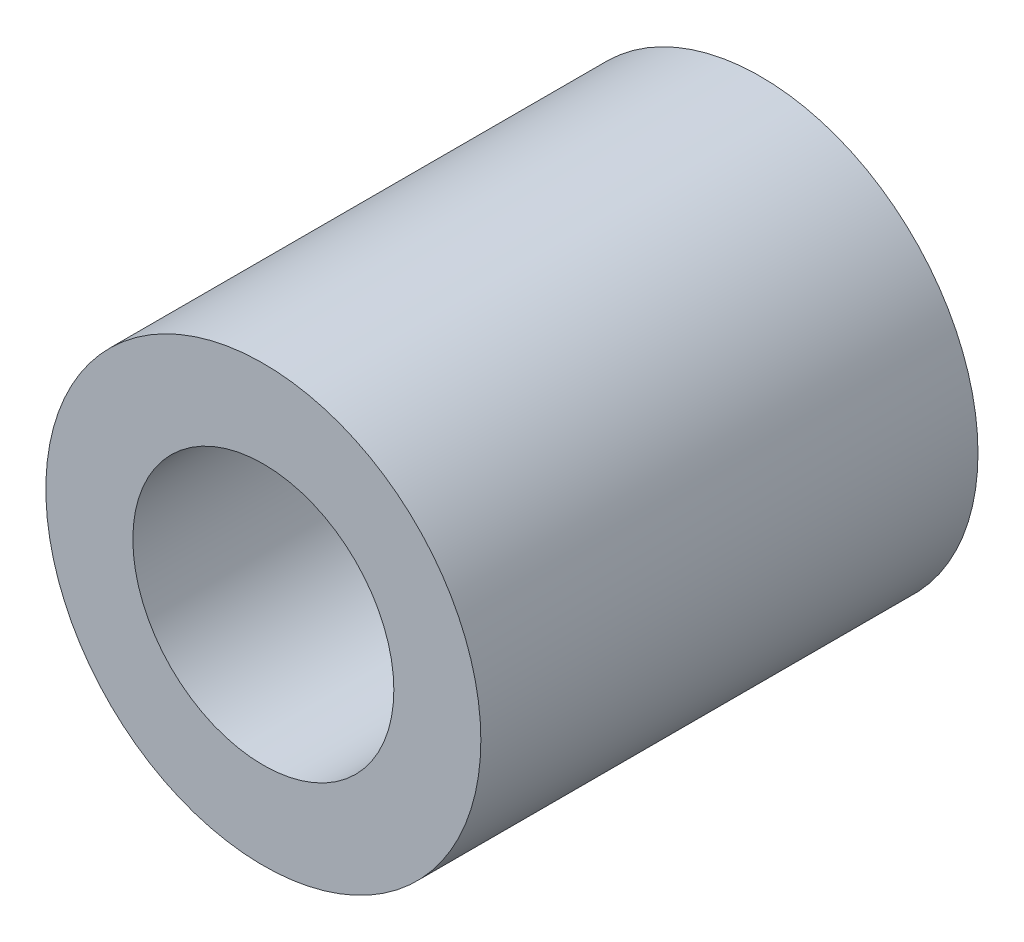
ISO-10303-21;
HEADER;
FILE_DESCRIPTION(('STEP AP214'),'2;1');
FILE_NAME('part.step','',(''),(''),'','','');
FILE_SCHEMA(('AUTOMOTIVE_DESIGN { 1 0 10303 214 1 1 1 1 }'));
ENDSEC;
DATA;
#1=APPLICATION_CONTEXT('core data for automotive mechanical design processes');
#2=APPLICATION_PROTOCOL_DEFINITION('international standard','automotive_design',2000,#1);
#3=PRODUCT_CONTEXT('',#1,'mechanical');
#4=PRODUCT('Part','Part','',(#3));
#5=PRODUCT_RELATED_PRODUCT_CATEGORY('part','',(#4));
#6=PRODUCT_DEFINITION_FORMATION('','',#4);
#7=PRODUCT_DEFINITION_CONTEXT('part definition',#1,'design');
#8=PRODUCT_DEFINITION('design','',#6,#7);
#9=PRODUCT_DEFINITION_SHAPE('','',#8);
#10=(LENGTH_UNIT() NAMED_UNIT(*) SI_UNIT(.MILLI.,.METRE.));
#11=(NAMED_UNIT(*) PLANE_ANGLE_UNIT() SI_UNIT($,.RADIAN.));
#12=(NAMED_UNIT(*) SI_UNIT($,.STERADIAN.) SOLID_ANGLE_UNIT());
#13=UNCERTAINTY_MEASURE_WITH_UNIT(LENGTH_MEASURE(1.E-05),#10,'distance_accuracy_value','');
#14=(GEOMETRIC_REPRESENTATION_CONTEXT(3) GLOBAL_UNCERTAINTY_ASSIGNED_CONTEXT((#13)) GLOBAL_UNIT_ASSIGNED_CONTEXT((#10,
#11,#12)) REPRESENTATION_CONTEXT('',''));
#15=CARTESIAN_POINT('',(0.,0.,0.));
#16=DIRECTION('',(0.,0.,1.));
#17=DIRECTION('',(1.,0.,0.));
#18=AXIS2_PLACEMENT_3D('',#15,#16,#17);
#19=CARTESIAN_POINT('',(0.,0.,8.));
#20=DIRECTION('',(0.,0.,1.));
#21=DIRECTION('',(1.,0.,0.));
#22=AXIS2_PLACEMENT_3D('',#19,#20,#21);
#23=PLANE('',#22);
#24=CARTESIAN_POINT('',(0.,0.,8.));
#25=DIRECTION('',(0.,0.,1.));
#26=DIRECTION('',(1.,0.,0.));
#27=AXIS2_PLACEMENT_3D('',#24,#25,#26);
#28=CIRCLE('',#27,3.5);
#29=CARTESIAN_POINT('',(3.5,0.,8.));
#30=VERTEX_POINT('',#29);
#31=EDGE_CURVE('E10',#30,#30,#28,.T.);
#32=ORIENTED_EDGE('',*,*,#31,.T.);
#33=EDGE_LOOP('',(#32));
#34=FACE_BOUND('',#33,.T.);
#35=CARTESIAN_POINT('',(0.,0.,8.));
#36=DIRECTION('',(0.,0.,1.));
#37=DIRECTION('',(1.,0.,0.));
#38=AXIS2_PLACEMENT_3D('',#35,#36,#37);
#39=CIRCLE('',#38,2.1);
#40=CARTESIAN_POINT('',(2.1,0.,8.));
#41=VERTEX_POINT('',#40);
#42=EDGE_CURVE('E48',#41,#41,#39,.T.);
#43=ORIENTED_EDGE('',*,*,#42,.F.);
#44=EDGE_LOOP('',(#43));
#45=FACE_BOUND('',#44,.T.);
#46=ADVANCED_FACE('F37',(#34,#45),#23,.T.);
#47=CARTESIAN_POINT('',(0.,0.,0.));
#48=DIRECTION('',(0.,0.,1.));
#49=DIRECTION('',(1.,0.,0.));
#50=AXIS2_PLACEMENT_3D('',#47,#48,#49);
#51=PLANE('',#50);
#52=CARTESIAN_POINT('',(0.,0.,0.));
#53=DIRECTION('',(0.,0.,1.));
#54=DIRECTION('',(1.,0.,0.));
#55=AXIS2_PLACEMENT_3D('',#52,#53,#54);
#56=CIRCLE('',#55,3.5);
#57=CARTESIAN_POINT('',(3.5,0.,0.));
#58=VERTEX_POINT('',#57);
#59=EDGE_CURVE('E41',#58,#58,#56,.T.);
#60=ORIENTED_EDGE('',*,*,#59,.F.);
#61=EDGE_LOOP('',(#60));
#62=FACE_BOUND('',#61,.T.);
#63=CARTESIAN_POINT('',(0.,0.,0.));
#64=DIRECTION('',(0.,0.,1.));
#65=DIRECTION('',(1.,0.,0.));
#66=AXIS2_PLACEMENT_3D('',#63,#64,#65);
#67=CIRCLE('',#66,2.1);
#68=CARTESIAN_POINT('',(2.1,0.,0.));
#69=VERTEX_POINT('',#68);
#70=EDGE_CURVE('E50',#69,#69,#67,.T.);
#71=ORIENTED_EDGE('',*,*,#70,.T.);
#72=EDGE_LOOP('',(#71));
#73=FACE_BOUND('',#72,.T.);
#74=ADVANCED_FACE('F60',(#62,#73),#51,.F.);
#75=CARTESIAN_POINT('',(0.,0.,8.));
#76=DIRECTION('',(0.,0.,-1.));
#77=DIRECTION('',(-1.,0.,0.));
#78=AXIS2_PLACEMENT_3D('',#75,#76,#77);
#79=CYLINDRICAL_SURFACE('',#78,3.5);
#80=ORIENTED_EDGE('',*,*,#31,.F.);
#81=EDGE_LOOP('',(#80));
#82=FACE_BOUND('',#81,.T.);
#83=ORIENTED_EDGE('',*,*,#59,.T.);
#84=EDGE_LOOP('',(#83));
#85=FACE_BOUND('',#84,.T.);
#86=ADVANCED_FACE('F39',(#82,#85),#79,.T.);
#87=CARTESIAN_POINT('',(0.,0.,8.));
#88=DIRECTION('',(0.,0.,-1.));
#89=DIRECTION('',(-1.,0.,0.));
#90=AXIS2_PLACEMENT_3D('',#87,#88,#89);
#91=CYLINDRICAL_SURFACE('',#90,2.1);
#92=ORIENTED_EDGE('',*,*,#42,.T.);
#93=EDGE_LOOP('',(#92));
#94=FACE_BOUND('',#93,.T.);
#95=ORIENTED_EDGE('',*,*,#70,.F.);
#96=EDGE_LOOP('',(#95));
#97=FACE_BOUND('',#96,.T.);
#98=ADVANCED_FACE('F56',(#94,#97),#91,.F.);
#99=CLOSED_SHELL('',(#46,#74,#86,#98));
#100=MANIFOLD_SOLID_BREP('B2',#99);
#101=ADVANCED_BREP_SHAPE_REPRESENTATION('',(#18,#100),#14);
#102=SHAPE_DEFINITION_REPRESENTATION(#9,#101);
ENDSEC;
END-ISO-10303-21;
